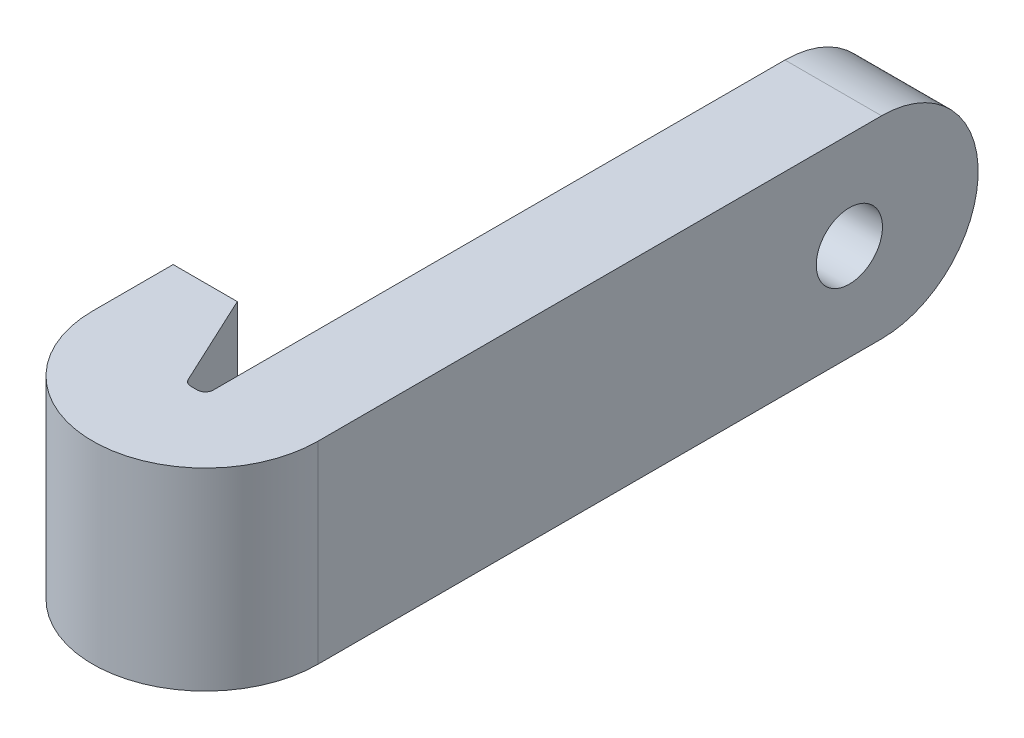
ISO-10303-21;
HEADER;
FILE_DESCRIPTION(('STEP AP214'),'2;1');
FILE_NAME('part.step','',(''),(''),'','','');
FILE_SCHEMA(('AUTOMOTIVE_DESIGN { 1 0 10303 214 1 1 1 1 }'));
ENDSEC;
DATA;
#1=APPLICATION_CONTEXT('core data for automotive mechanical design processes');
#2=APPLICATION_PROTOCOL_DEFINITION('international standard','automotive_design',2000,#1);
#3=PRODUCT_CONTEXT('',#1,'mechanical');
#4=PRODUCT('Part','Part','',(#3));
#5=PRODUCT_RELATED_PRODUCT_CATEGORY('part','',(#4));
#6=PRODUCT_DEFINITION_FORMATION('','',#4);
#7=PRODUCT_DEFINITION_CONTEXT('part definition',#1,'design');
#8=PRODUCT_DEFINITION('design','',#6,#7);
#9=PRODUCT_DEFINITION_SHAPE('','',#8);
#10=(LENGTH_UNIT() NAMED_UNIT(*) SI_UNIT(.MILLI.,.METRE.));
#11=(NAMED_UNIT(*) PLANE_ANGLE_UNIT() SI_UNIT($,.RADIAN.));
#12=(NAMED_UNIT(*) SI_UNIT($,.STERADIAN.) SOLID_ANGLE_UNIT());
#13=UNCERTAINTY_MEASURE_WITH_UNIT(LENGTH_MEASURE(1.E-05),#10,'distance_accuracy_value','');
#14=(GEOMETRIC_REPRESENTATION_CONTEXT(3) GLOBAL_UNCERTAINTY_ASSIGNED_CONTEXT((#13)) GLOBAL_UNIT_ASSIGNED_CONTEXT((#10,
#11,#12)) REPRESENTATION_CONTEXT('',''));
#15=CARTESIAN_POINT('',(0.,0.,0.));
#16=DIRECTION('',(0.,0.,1.));
#17=DIRECTION('',(1.,0.,0.));
#18=AXIS2_PLACEMENT_3D('',#15,#16,#17);
#19=CARTESIAN_POINT('',(-1.5875,4.7625,-33.3375));
#20=DIRECTION('',(-1.,0.,0.));
#21=DIRECTION('',(0.,0.,1.));
#22=AXIS2_PLACEMENT_3D('',#19,#20,#21);
#23=CYLINDRICAL_SURFACE('',#22,4.7625);
#24=DIRECTION('',(-1.,0.,0.));
#25=VECTOR('',#24,1.);
#26=CARTESIAN_POINT('',(0.,0.,-33.3375));
#27=LINE('',#26,#25);
#28=CARTESIAN_POINT('',(-1.5875,0.,-33.3375));
#29=VERTEX_POINT('',#28);
#30=CARTESIAN_POINT('',(3.175,0.,-33.3375));
#31=VERTEX_POINT('',#30);
#32=EDGE_CURVE('E190',#29,#31,#27,.F.);
#33=ORIENTED_EDGE('',*,*,#32,.F.);
#34=CARTESIAN_POINT('',(-1.5875,4.7625,-33.3375));
#35=DIRECTION('',(1.,0.,0.));
#36=DIRECTION('',(0.,0.,-1.));
#37=AXIS2_PLACEMENT_3D('',#34,#35,#36);
#38=CIRCLE('',#37,4.7625);
#39=CARTESIAN_POINT('',(-1.5875,9.525,-33.3375));
#40=VERTEX_POINT('',#39);
#41=EDGE_CURVE('E47',#40,#29,#38,.F.);
#42=ORIENTED_EDGE('',*,*,#41,.F.);
#43=DIRECTION('',(1.,0.,0.));
#44=VECTOR('',#43,1.);
#45=CARTESIAN_POINT('',(-1.5875,9.525,-33.3375));
#46=LINE('',#45,#44);
#47=CARTESIAN_POINT('',(3.175,9.525,-33.3375));
#48=VERTEX_POINT('',#47);
#49=EDGE_CURVE('E193',#48,#40,#46,.F.);
#50=ORIENTED_EDGE('',*,*,#49,.F.);
#51=CARTESIAN_POINT('',(3.175,4.7625,-33.3375));
#52=DIRECTION('',(-1.,0.,0.));
#53=DIRECTION('',(0.,0.,1.));
#54=AXIS2_PLACEMENT_3D('',#51,#52,#53);
#55=CIRCLE('',#54,4.7625);
#56=EDGE_CURVE('E11',#31,#48,#55,.F.);
#57=ORIENTED_EDGE('',*,*,#56,.F.);
#58=EDGE_LOOP('',(#33,#42,#50,#57));
#59=FACE_BOUND('',#58,.T.);
#60=ADVANCED_FACE('F39',(#59),#23,.T.);
#61=CARTESIAN_POINT('',(-2.38125,0.,-5.55625));
#62=DIRECTION('',(0.,-1.,0.));
#63=DIRECTION('',(0.,0.,-1.));
#64=AXIS2_PLACEMENT_3D('',#61,#62,#63);
#65=CYLINDRICAL_SURFACE('',#64,5.55625);
#66=DIRECTION('',(0.,-1.,0.));
#67=VECTOR('',#66,1.);
#68=CARTESIAN_POINT('',(-7.9375,9.525,-5.55625));
#69=LINE('',#68,#67);
#70=CARTESIAN_POINT('',(-7.9375,0.,-5.55625));
#71=VERTEX_POINT('',#70);
#72=CARTESIAN_POINT('',(-7.9375,9.525,-5.55625));
#73=VERTEX_POINT('',#72);
#74=EDGE_CURVE('E180',#71,#73,#69,.F.);
#75=ORIENTED_EDGE('',*,*,#74,.F.);
#76=CARTESIAN_POINT('',(-2.38125,0.,-5.55625));
#77=DIRECTION('',(0.,1.,0.));
#78=DIRECTION('',(0.,0.,1.));
#79=AXIS2_PLACEMENT_3D('',#76,#77,#78);
#80=CIRCLE('',#79,5.55625);
#81=CARTESIAN_POINT('',(3.175,0.,-5.55625));
#82=VERTEX_POINT('',#81);
#83=EDGE_CURVE('E186',#82,#71,#80,.F.);
#84=ORIENTED_EDGE('',*,*,#83,.F.);
#85=DIRECTION('',(0.,-1.,0.));
#86=VECTOR('',#85,1.);
#87=CARTESIAN_POINT('',(3.175,9.525,-5.55625));
#88=LINE('',#87,#86);
#89=CARTESIAN_POINT('',(3.175,9.525,-5.55625));
#90=VERTEX_POINT('',#89);
#91=EDGE_CURVE('E183',#90,#82,#88,.T.);
#92=ORIENTED_EDGE('',*,*,#91,.F.);
#93=CARTESIAN_POINT('',(-2.38125,9.525,-5.55625));
#94=DIRECTION('',(0.,1.,0.));
#95=DIRECTION('',(0.,0.,1.));
#96=AXIS2_PLACEMENT_3D('',#93,#94,#95);
#97=CIRCLE('',#96,5.55625);
#98=EDGE_CURVE('E188',#73,#90,#97,.T.);
#99=ORIENTED_EDGE('',*,*,#98,.F.);
#100=EDGE_LOOP('',(#75,#84,#92,#99));
#101=FACE_BOUND('',#100,.T.);
#102=ADVANCED_FACE('F226',(#101),#65,.T.);
#103=CARTESIAN_POINT('',(3.175,9.525,0.));
#104=DIRECTION('',(-1.,0.,0.));
#105=DIRECTION('',(0.,0.,1.));
#106=AXIS2_PLACEMENT_3D('',#103,#104,#105);
#107=PLANE('',#106);
#108=CARTESIAN_POINT('',(3.175,4.7625,-31.75));
#109=DIRECTION('',(1.,0.,0.));
#110=DIRECTION('',(0.,0.,-1.));
#111=AXIS2_PLACEMENT_3D('',#108,#109,#110);
#112=CIRCLE('',#111,1.63194999999999);
#113=CARTESIAN_POINT('',(3.175,4.7625,-33.38195));
#114=VERTEX_POINT('',#113);
#115=EDGE_CURVE('E217',#114,#114,#112,.T.);
#116=ORIENTED_EDGE('',*,*,#115,.F.);
#117=EDGE_LOOP('',(#116));
#118=FACE_BOUND('',#117,.T.);
#119=DIRECTION('',(0.,0.,-1.));
#120=VECTOR('',#119,1.);
#121=CARTESIAN_POINT('',(3.175,0.,0.));
#122=LINE('',#121,#120);
#123=EDGE_CURVE('E147',#82,#31,#122,.T.);
#124=ORIENTED_EDGE('',*,*,#123,.T.);
#125=ORIENTED_EDGE('',*,*,#56,.T.);
#126=DIRECTION('',(0.,0.,-1.));
#127=VECTOR('',#126,1.);
#128=CARTESIAN_POINT('',(3.175,9.525,0.));
#129=LINE('',#128,#127);
#130=EDGE_CURVE('E161',#90,#48,#129,.T.);
#131=ORIENTED_EDGE('',*,*,#130,.F.);
#132=ORIENTED_EDGE('',*,*,#91,.T.);
#133=EDGE_LOOP('',(#124,#125,#131,#132));
#134=FACE_BOUND('',#133,.T.);
#135=ADVANCED_FACE('F224',(#118,#134),#107,.F.);
#136=CARTESIAN_POINT('',(-1.5875,9.525,-4.7625));
#137=DIRECTION('',(1.,0.,0.));
#138=DIRECTION('',(0.,0.,-1.));
#139=AXIS2_PLACEMENT_3D('',#136,#137,#138);
#140=PLANE('',#139);
#141=CARTESIAN_POINT('',(-1.5875,4.7625,-31.75));
#142=DIRECTION('',(1.,0.,0.));
#143=DIRECTION('',(0.,0.,-1.));
#144=AXIS2_PLACEMENT_3D('',#141,#142,#143);
#145=CIRCLE('',#144,1.63194999999999);
#146=CARTESIAN_POINT('',(-1.5875,4.7625,-33.38195));
#147=VERTEX_POINT('',#146);
#148=EDGE_CURVE('E150',#147,#147,#145,.T.);
#149=ORIENTED_EDGE('',*,*,#148,.T.);
#150=EDGE_LOOP('',(#149));
#151=FACE_BOUND('',#150,.T.);
#152=DIRECTION('',(0.,0.,1.));
#153=VECTOR('',#152,1.);
#154=CARTESIAN_POINT('',(-1.5875,9.525,-4.7625));
#155=LINE('',#154,#153);
#156=CARTESIAN_POINT('',(-1.5875,9.525,-5.159375));
#157=VERTEX_POINT('',#156);
#158=EDGE_CURVE('E198',#40,#157,#155,.T.);
#159=ORIENTED_EDGE('',*,*,#158,.F.);
#160=ORIENTED_EDGE('',*,*,#41,.T.);
#161=DIRECTION('',(0.,0.,1.));
#162=VECTOR('',#161,1.);
#163=CARTESIAN_POINT('',(-1.5875,0.,-4.7625));
#164=LINE('',#163,#162);
#165=CARTESIAN_POINT('',(-1.5875,0.,-5.159375));
#166=VERTEX_POINT('',#165);
#167=EDGE_CURVE('E149',#29,#166,#164,.T.);
#168=ORIENTED_EDGE('',*,*,#167,.T.);
#169=DIRECTION('',(0.,-1.,0.));
#170=VECTOR('',#169,1.);
#171=CARTESIAN_POINT('',(-1.5875,9.525,-5.159375));
#172=LINE('',#171,#170);
#173=EDGE_CURVE('E169',#166,#157,#172,.F.);
#174=ORIENTED_EDGE('',*,*,#173,.T.);
#175=EDGE_LOOP('',(#159,#160,#168,#174));
#176=FACE_BOUND('',#175,.T.);
#177=ADVANCED_FACE('F196',(#151,#176),#140,.F.);
#178=CARTESIAN_POINT('',(-2.5527,9.525,-4.7625));
#179=DIRECTION('',(0.,0.,1.));
#180=DIRECTION('',(1.,0.,0.));
#181=AXIS2_PLACEMENT_3D('',#178,#179,#180);
#182=PLANE('',#181);
#183=DIRECTION('',(-1.,0.,0.));
#184=VECTOR('',#183,1.);
#185=CARTESIAN_POINT('',(-2.5527,0.,-4.7625));
#186=LINE('',#185,#184);
#187=CARTESIAN_POINT('',(-1.984375,0.,-4.7625));
#188=VERTEX_POINT('',#187);
#189=CARTESIAN_POINT('',(-2.29986274024202,0.,-4.7625));
#190=VERTEX_POINT('',#189);
#191=EDGE_CURVE('E152',#188,#190,#186,.T.);
#192=ORIENTED_EDGE('',*,*,#191,.T.);
#193=DIRECTION('',(0.,-1.,0.));
#194=VECTOR('',#193,1.);
#195=CARTESIAN_POINT('',(-2.29986274024202,9.525,-4.7625));
#196=LINE('',#195,#194);
#197=CARTESIAN_POINT('',(-2.29986274024202,9.525,-4.7625));
#198=VERTEX_POINT('',#197);
#199=EDGE_CURVE('E167',#190,#198,#196,.F.);
#200=ORIENTED_EDGE('',*,*,#199,.T.);
#201=DIRECTION('',(-1.,0.,0.));
#202=VECTOR('',#201,1.);
#203=CARTESIAN_POINT('',(-2.5527,9.525,-4.7625));
#204=LINE('',#203,#202);
#205=CARTESIAN_POINT('',(-1.984375,9.525,-4.7625));
#206=VERTEX_POINT('',#205);
#207=EDGE_CURVE('E127',#206,#198,#204,.T.);
#208=ORIENTED_EDGE('',*,*,#207,.F.);
#209=DIRECTION('',(0.,-1.,0.));
#210=VECTOR('',#209,1.);
#211=CARTESIAN_POINT('',(-1.984375,0.,-4.7625));
#212=LINE('',#211,#210);
#213=EDGE_CURVE('E164',#206,#188,#212,.T.);
#214=ORIENTED_EDGE('',*,*,#213,.T.);
#215=EDGE_LOOP('',(#192,#200,#208,#214));
#216=FACE_BOUND('',#215,.T.);
#217=ADVANCED_FACE('F210',(#216),#182,.F.);
#218=CARTESIAN_POINT('',(-4.77349022196314,9.525,-9.525));
#219=DIRECTION('',(-0.906307787036652,0.,0.422618261740694));
#220=DIRECTION('',(0.422618261740694,0.,0.906307787036653));
#221=AXIS2_PLACEMENT_3D('',#218,#219,#220);
#222=PLANE('',#221);
#223=DIRECTION('',(-0.422618261740694,0.,-0.906307787036653));
#224=VECTOR('',#223,1.);
#225=CARTESIAN_POINT('',(-4.77349022196314,9.525,-9.525));
#226=LINE('',#225,#224);
#227=CARTESIAN_POINT('',(-2.6595536432222,9.525,-4.99164837737166));
#228=VERTEX_POINT('',#227);
#229=CARTESIAN_POINT('',(-4.77349022196314,9.525,-9.525));
#230=VERTEX_POINT('',#229);
#231=EDGE_CURVE('E113',#228,#230,#226,.T.);
#232=ORIENTED_EDGE('',*,*,#231,.F.);
#233=DIRECTION('',(0.,-1.,0.));
#234=VECTOR('',#233,1.);
#235=CARTESIAN_POINT('',(-2.6595536432222,0.,-4.99164837737166));
#236=LINE('',#235,#234);
#237=CARTESIAN_POINT('',(-2.6595536432222,0.,-4.99164837737166));
#238=VERTEX_POINT('',#237);
#239=EDGE_CURVE('E136',#228,#238,#236,.T.);
#240=ORIENTED_EDGE('',*,*,#239,.T.);
#241=DIRECTION('',(-0.422618261740694,0.,-0.906307787036653));
#242=VECTOR('',#241,1.);
#243=CARTESIAN_POINT('',(-4.77349022196314,0.,-9.525));
#244=LINE('',#243,#242);
#245=CARTESIAN_POINT('',(-4.77349022196314,0.,-9.525));
#246=VERTEX_POINT('',#245);
#247=EDGE_CURVE('E133',#238,#246,#244,.T.);
#248=ORIENTED_EDGE('',*,*,#247,.T.);
#249=DIRECTION('',(0.,-1.,0.));
#250=VECTOR('',#249,1.);
#251=CARTESIAN_POINT('',(-4.77349022196314,9.525,-9.525));
#252=LINE('',#251,#250);
#253=EDGE_CURVE('E130',#230,#246,#252,.T.);
#254=ORIENTED_EDGE('',*,*,#253,.F.);
#255=EDGE_LOOP('',(#232,#240,#248,#254));
#256=FACE_BOUND('',#255,.T.);
#257=ADVANCED_FACE('F131',(#256),#222,.F.);
#258=CARTESIAN_POINT('',(-7.9375,9.525,-9.525));
#259=DIRECTION('',(0.,0.,1.));
#260=DIRECTION('',(1.,0.,0.));
#261=AXIS2_PLACEMENT_3D('',#258,#259,#260);
#262=PLANE('',#261);
#263=DIRECTION('',(-1.,0.,0.));
#264=VECTOR('',#263,1.);
#265=CARTESIAN_POINT('',(-7.9375,0.,-9.525));
#266=LINE('',#265,#264);
#267=CARTESIAN_POINT('',(-7.9375,0.,-9.525));
#268=VERTEX_POINT('',#267);
#269=EDGE_CURVE('E156',#246,#268,#266,.T.);
#270=ORIENTED_EDGE('',*,*,#269,.T.);
#271=DIRECTION('',(0.,-1.,0.));
#272=VECTOR('',#271,1.);
#273=CARTESIAN_POINT('',(-7.9375,9.525,-9.525));
#274=LINE('',#273,#272);
#275=CARTESIAN_POINT('',(-7.9375,9.525,-9.525));
#276=VERTEX_POINT('',#275);
#277=EDGE_CURVE('E137',#276,#268,#274,.T.);
#278=ORIENTED_EDGE('',*,*,#277,.F.);
#279=DIRECTION('',(-1.,0.,0.));
#280=VECTOR('',#279,1.);
#281=CARTESIAN_POINT('',(-7.9375,9.525,-9.525));
#282=LINE('',#281,#280);
#283=EDGE_CURVE('E119',#230,#276,#282,.T.);
#284=ORIENTED_EDGE('',*,*,#283,.F.);
#285=ORIENTED_EDGE('',*,*,#253,.T.);
#286=EDGE_LOOP('',(#270,#278,#284,#285));
#287=FACE_BOUND('',#286,.T.);
#288=ADVANCED_FACE('F139',(#287),#262,.F.);
#289=CARTESIAN_POINT('',(-7.9375,9.525,0.));
#290=DIRECTION('',(1.,0.,0.));
#291=DIRECTION('',(0.,0.,-1.));
#292=AXIS2_PLACEMENT_3D('',#289,#290,#291);
#293=PLANE('',#292);
#294=DIRECTION('',(0.,0.,1.));
#295=VECTOR('',#294,1.);
#296=CARTESIAN_POINT('',(-7.9375,0.,0.));
#297=LINE('',#296,#295);
#298=EDGE_CURVE('E158',#268,#71,#297,.T.);
#299=ORIENTED_EDGE('',*,*,#298,.T.);
#300=ORIENTED_EDGE('',*,*,#74,.T.);
#301=DIRECTION('',(0.,0.,1.));
#302=VECTOR('',#301,1.);
#303=CARTESIAN_POINT('',(-7.9375,9.525,0.));
#304=LINE('',#303,#302);
#305=EDGE_CURVE('E142',#276,#73,#304,.T.);
#306=ORIENTED_EDGE('',*,*,#305,.F.);
#307=ORIENTED_EDGE('',*,*,#277,.T.);
#308=EDGE_LOOP('',(#299,#300,#306,#307));
#309=FACE_BOUND('',#308,.T.);
#310=ADVANCED_FACE('F233',(#309),#293,.F.);
#311=CARTESIAN_POINT('',(0.,9.525,0.));
#312=DIRECTION('',(0.,1.,0.));
#313=DIRECTION('',(0.,0.,1.));
#314=AXIS2_PLACEMENT_3D('',#311,#312,#313);
#315=PLANE('',#314);
#316=ORIENTED_EDGE('',*,*,#130,.T.);
#317=ORIENTED_EDGE('',*,*,#49,.T.);
#318=ORIENTED_EDGE('',*,*,#158,.T.);
#319=CARTESIAN_POINT('',(-1.984375,9.525,-5.159375));
#320=DIRECTION('',(0.,1.,0.));
#321=DIRECTION('',(0.,0.,1.));
#322=AXIS2_PLACEMENT_3D('',#319,#320,#321);
#323=CIRCLE('',#322,0.396875);
#324=EDGE_CURVE('E178',#157,#206,#323,.F.);
#325=ORIENTED_EDGE('',*,*,#324,.T.);
#326=ORIENTED_EDGE('',*,*,#207,.T.);
#327=CARTESIAN_POINT('',(-2.29986274024202,9.525,-5.159375));
#328=DIRECTION('',(0.,1.,0.));
#329=DIRECTION('',(0.,0.,1.));
#330=AXIS2_PLACEMENT_3D('',#327,#328,#329);
#331=CIRCLE('',#330,0.396875);
#332=EDGE_CURVE('E123',#198,#228,#331,.F.);
#333=ORIENTED_EDGE('',*,*,#332,.T.);
#334=ORIENTED_EDGE('',*,*,#231,.T.);
#335=ORIENTED_EDGE('',*,*,#283,.T.);
#336=ORIENTED_EDGE('',*,*,#305,.T.);
#337=ORIENTED_EDGE('',*,*,#98,.T.);
#338=EDGE_LOOP('',(#316,#317,#318,#325,#326,#333,#334,#335,#336,#337));
#339=FACE_BOUND('',#338,.T.);
#340=ADVANCED_FACE('F116',(#339),#315,.T.);
#341=CARTESIAN_POINT('',(0.,0.,0.));
#342=DIRECTION('',(0.,1.,0.));
#343=DIRECTION('',(0.,0.,1.));
#344=AXIS2_PLACEMENT_3D('',#341,#342,#343);
#345=PLANE('',#344);
#346=ORIENTED_EDGE('',*,*,#167,.F.);
#347=ORIENTED_EDGE('',*,*,#32,.T.);
#348=ORIENTED_EDGE('',*,*,#123,.F.);
#349=ORIENTED_EDGE('',*,*,#83,.T.);
#350=ORIENTED_EDGE('',*,*,#298,.F.);
#351=ORIENTED_EDGE('',*,*,#269,.F.);
#352=ORIENTED_EDGE('',*,*,#247,.F.);
#353=CARTESIAN_POINT('',(-2.29986274024202,0.,-5.159375));
#354=DIRECTION('',(0.,1.,0.));
#355=DIRECTION('',(0.,0.,1.));
#356=AXIS2_PLACEMENT_3D('',#353,#354,#355);
#357=CIRCLE('',#356,0.396875);
#358=EDGE_CURVE('E172',#238,#190,#357,.T.);
#359=ORIENTED_EDGE('',*,*,#358,.T.);
#360=ORIENTED_EDGE('',*,*,#191,.F.);
#361=CARTESIAN_POINT('',(-1.984375,0.,-5.159375));
#362=DIRECTION('',(0.,1.,0.));
#363=DIRECTION('',(0.,0.,1.));
#364=AXIS2_PLACEMENT_3D('',#361,#362,#363);
#365=CIRCLE('',#364,0.396875);
#366=EDGE_CURVE('E175',#188,#166,#365,.T.);
#367=ORIENTED_EDGE('',*,*,#366,.T.);
#368=EDGE_LOOP('',(#346,#347,#348,#349,#350,#351,#352,#359,#360,#367));
#369=FACE_BOUND('',#368,.T.);
#370=ADVANCED_FACE('F201',(#369),#345,.F.);
#371=CARTESIAN_POINT('',(-2.29986274024202,9.525,-5.159375));
#372=DIRECTION('',(0.,1.,0.));
#373=DIRECTION('',(0.,0.,1.));
#374=AXIS2_PLACEMENT_3D('',#371,#372,#373);
#375=CYLINDRICAL_SURFACE('',#374,0.396875);
#376=ORIENTED_EDGE('',*,*,#332,.F.);
#377=ORIENTED_EDGE('',*,*,#199,.F.);
#378=ORIENTED_EDGE('',*,*,#358,.F.);
#379=ORIENTED_EDGE('',*,*,#239,.F.);
#380=EDGE_LOOP('',(#376,#377,#378,#379));
#381=FACE_BOUND('',#380,.T.);
#382=ADVANCED_FACE('F255',(#381),#375,.F.);
#383=CARTESIAN_POINT('',(-1.984375,9.525,-5.159375));
#384=DIRECTION('',(0.,1.,0.));
#385=DIRECTION('',(0.,0.,1.));
#386=AXIS2_PLACEMENT_3D('',#383,#384,#385);
#387=CYLINDRICAL_SURFACE('',#386,0.396875);
#388=ORIENTED_EDGE('',*,*,#324,.F.);
#389=ORIENTED_EDGE('',*,*,#173,.F.);
#390=ORIENTED_EDGE('',*,*,#366,.F.);
#391=ORIENTED_EDGE('',*,*,#213,.F.);
#392=EDGE_LOOP('',(#388,#389,#390,#391));
#393=FACE_BOUND('',#392,.T.);
#394=ADVANCED_FACE('F207',(#393),#387,.F.);
#395=CARTESIAN_POINT('',(3.175,4.7625,-31.75));
#396=DIRECTION('',(1.,0.,0.));
#397=DIRECTION('',(0.,0.,-1.));
#398=AXIS2_PLACEMENT_3D('',#395,#396,#397);
#399=CYLINDRICAL_SURFACE('',#398,1.63194999999999);
#400=ORIENTED_EDGE('',*,*,#115,.T.);
#401=EDGE_LOOP('',(#400));
#402=FACE_BOUND('',#401,.T.);
#403=ORIENTED_EDGE('',*,*,#148,.F.);
#404=EDGE_LOOP('',(#403));
#405=FACE_BOUND('',#404,.T.);
#406=ADVANCED_FACE('F221',(#402,#405),#399,.F.);
#407=CLOSED_SHELL('',(#60,#102,#135,#177,#217,#257,#288,#310,#340,#370,#382,#394,#406));
#408=MANIFOLD_SOLID_BREP('B2',#407);
#409=ADVANCED_BREP_SHAPE_REPRESENTATION('',(#18,#408),#14);
#410=SHAPE_DEFINITION_REPRESENTATION(#9,#409);
ENDSEC;
END-ISO-10303-21;
